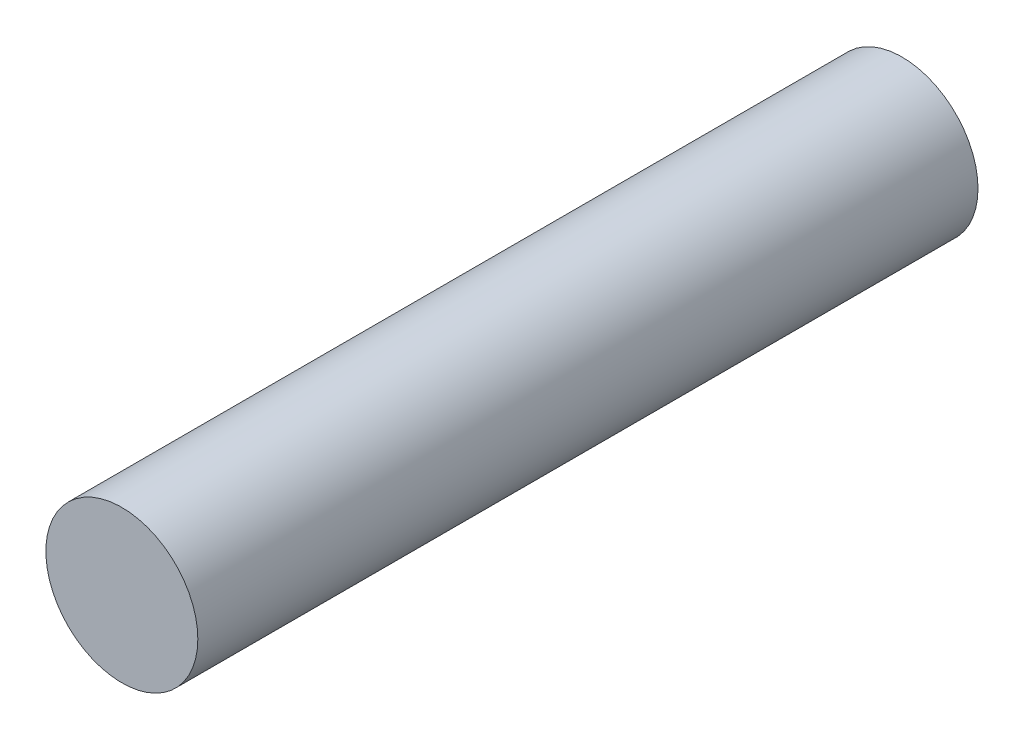
ISO-10303-21;
HEADER;
FILE_DESCRIPTION(('STEP AP214'),'2;1');
FILE_NAME('part.step','',(''),(''),'','','');
FILE_SCHEMA(('AUTOMOTIVE_DESIGN { 1 0 10303 214 1 1 1 1 }'));
ENDSEC;
DATA;
#1=APPLICATION_CONTEXT('core data for automotive mechanical design processes');
#2=APPLICATION_PROTOCOL_DEFINITION('international standard','automotive_design',2000,#1);
#3=PRODUCT_CONTEXT('',#1,'mechanical');
#4=PRODUCT('Part','Part','',(#3));
#5=PRODUCT_RELATED_PRODUCT_CATEGORY('part','',(#4));
#6=PRODUCT_DEFINITION_FORMATION('','',#4);
#7=PRODUCT_DEFINITION_CONTEXT('part definition',#1,'design');
#8=PRODUCT_DEFINITION('design','',#6,#7);
#9=PRODUCT_DEFINITION_SHAPE('','',#8);
#10=(LENGTH_UNIT() NAMED_UNIT(*) SI_UNIT(.MILLI.,.METRE.));
#11=(NAMED_UNIT(*) PLANE_ANGLE_UNIT() SI_UNIT($,.RADIAN.));
#12=(NAMED_UNIT(*) SI_UNIT($,.STERADIAN.) SOLID_ANGLE_UNIT());
#13=UNCERTAINTY_MEASURE_WITH_UNIT(LENGTH_MEASURE(1.E-05),#10,'distance_accuracy_value','');
#14=(GEOMETRIC_REPRESENTATION_CONTEXT(3) GLOBAL_UNCERTAINTY_ASSIGNED_CONTEXT((#13)) GLOBAL_UNIT_ASSIGNED_CONTEXT((#10,
#11,#12)) REPRESENTATION_CONTEXT('',''));
#15=CARTESIAN_POINT('',(0.,0.,0.));
#16=DIRECTION('',(0.,0.,1.));
#17=DIRECTION('',(1.,0.,0.));
#18=AXIS2_PLACEMENT_3D('',#15,#16,#17);
#19=CARTESIAN_POINT('',(0.,0.,9.779));
#20=DIRECTION('',(0.,0.,-1.));
#21=DIRECTION('',(-1.,0.,0.));
#22=AXIS2_PLACEMENT_3D('',#19,#20,#21);
#23=CYLINDRICAL_SURFACE('',#22,0.9525);
#24=CARTESIAN_POINT('',(0.,0.,9.779));
#25=DIRECTION('',(0.,0.,1.));
#26=DIRECTION('',(1.,0.,0.));
#27=AXIS2_PLACEMENT_3D('',#24,#25,#26);
#28=CIRCLE('',#27,0.9525);
#29=CARTESIAN_POINT('',(0.9525,0.,9.779));
#30=VERTEX_POINT('',#29);
#31=EDGE_CURVE('E10',#30,#30,#28,.T.);
#32=ORIENTED_EDGE('',*,*,#31,.F.);
#33=EDGE_LOOP('',(#32));
#34=FACE_BOUND('',#33,.T.);
#35=CARTESIAN_POINT('',(0.,0.,0.));
#36=DIRECTION('',(0.,0.,1.));
#37=DIRECTION('',(1.,0.,0.));
#38=AXIS2_PLACEMENT_3D('',#35,#36,#37);
#39=CIRCLE('',#38,0.9525);
#40=CARTESIAN_POINT('',(0.9525,0.,0.));
#41=VERTEX_POINT('',#40);
#42=EDGE_CURVE('E42',#41,#41,#39,.T.);
#43=ORIENTED_EDGE('',*,*,#42,.T.);
#44=EDGE_LOOP('',(#43));
#45=FACE_BOUND('',#44,.T.);
#46=ADVANCED_FACE('F39',(#34,#45),#23,.T.);
#47=CARTESIAN_POINT('',(0.,0.,9.779));
#48=DIRECTION('',(0.,0.,1.));
#49=DIRECTION('',(1.,0.,0.));
#50=AXIS2_PLACEMENT_3D('',#47,#48,#49);
#51=PLANE('',#50);
#52=ORIENTED_EDGE('',*,*,#31,.T.);
#53=EDGE_LOOP('',(#52));
#54=FACE_BOUND('',#53,.T.);
#55=ADVANCED_FACE('F54',(#54),#51,.T.);
#56=CARTESIAN_POINT('',(0.,0.,0.));
#57=DIRECTION('',(0.,0.,1.));
#58=DIRECTION('',(1.,0.,0.));
#59=AXIS2_PLACEMENT_3D('',#56,#57,#58);
#60=PLANE('',#59);
#61=ORIENTED_EDGE('',*,*,#42,.F.);
#62=EDGE_LOOP('',(#61));
#63=FACE_BOUND('',#62,.T.);
#64=ADVANCED_FACE('F52',(#63),#60,.F.);
#65=CLOSED_SHELL('',(#46,#55,#64));
#66=MANIFOLD_SOLID_BREP('B2',#65);
#67=ADVANCED_BREP_SHAPE_REPRESENTATION('',(#18,#66),#14);
#68=SHAPE_DEFINITION_REPRESENTATION(#9,#67);
ENDSEC;
END-ISO-10303-21;
